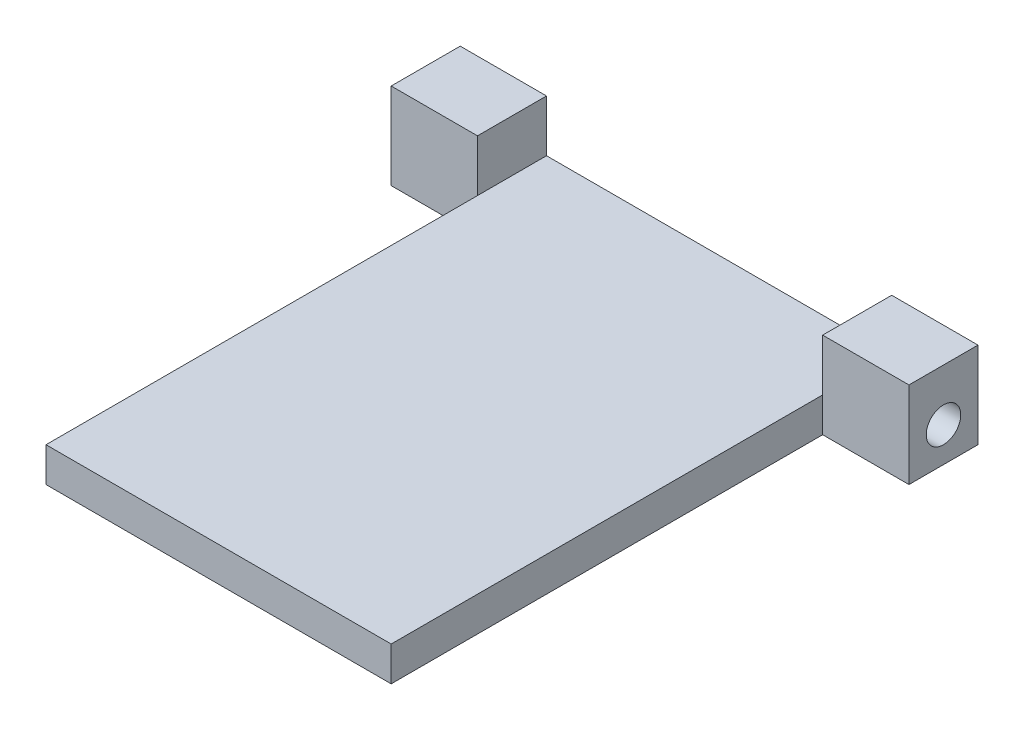
ISO-10303-21;
HEADER;
FILE_DESCRIPTION(('STEP AP214'),'2;1');
FILE_NAME('part.step','',(''),(''),'','','');
FILE_SCHEMA(('AUTOMOTIVE_DESIGN { 1 0 10303 214 1 1 1 1 }'));
ENDSEC;
DATA;
#1=APPLICATION_CONTEXT('core data for automotive mechanical design processes');
#2=APPLICATION_PROTOCOL_DEFINITION('international standard','automotive_design',2000,#1);
#3=PRODUCT_CONTEXT('',#1,'mechanical');
#4=PRODUCT('Part','Part','',(#3));
#5=PRODUCT_RELATED_PRODUCT_CATEGORY('part','',(#4));
#6=PRODUCT_DEFINITION_FORMATION('','',#4);
#7=PRODUCT_DEFINITION_CONTEXT('part definition',#1,'design');
#8=PRODUCT_DEFINITION('design','',#6,#7);
#9=PRODUCT_DEFINITION_SHAPE('','',#8);
#10=(LENGTH_UNIT() NAMED_UNIT(*) SI_UNIT(.MILLI.,.METRE.));
#11=(NAMED_UNIT(*) PLANE_ANGLE_UNIT() SI_UNIT($,.RADIAN.));
#12=(NAMED_UNIT(*) SI_UNIT($,.STERADIAN.) SOLID_ANGLE_UNIT());
#13=UNCERTAINTY_MEASURE_WITH_UNIT(LENGTH_MEASURE(1.E-05),#10,'distance_accuracy_value','');
#14=(GEOMETRIC_REPRESENTATION_CONTEXT(3) GLOBAL_UNCERTAINTY_ASSIGNED_CONTEXT((#13)) GLOBAL_UNIT_ASSIGNED_CONTEXT((#10,
#11,#12)) REPRESENTATION_CONTEXT('',''));
#15=CARTESIAN_POINT('',(0.,0.,0.));
#16=DIRECTION('',(0.,0.,1.));
#17=DIRECTION('',(1.,0.,0.));
#18=AXIS2_PLACEMENT_3D('',#15,#16,#17);
#19=CARTESIAN_POINT('',(-50.,-40.,85.));
#20=DIRECTION('',(-1.,0.,0.));
#21=DIRECTION('',(0.,-1.,0.));
#22=AXIS2_PLACEMENT_3D('',#19,#20,#21);
#23=PLANE('',#22);
#24=DIRECTION('',(0.,1.,0.));
#25=VECTOR('',#24,1.);
#26=CARTESIAN_POINT('',(-50.,-50.,60.));
#27=LINE('',#26,#25);
#28=CARTESIAN_POINT('',(-50.,-50.,60.));
#29=VERTEX_POINT('',#28);
#30=CARTESIAN_POINT('',(-50.,-40.,60.));
#31=VERTEX_POINT('',#30);
#32=EDGE_CURVE('E62',#29,#31,#27,.T.);
#33=ORIENTED_EDGE('',*,*,#32,.T.);
#34=DIRECTION('',(0.,0.,-1.));
#35=VECTOR('',#34,1.);
#36=CARTESIAN_POINT('',(-50.,-40.,85.));
#37=LINE('',#36,#35);
#38=CARTESIAN_POINT('',(-50.,-40.,-65.));
#39=VERTEX_POINT('',#38);
#40=EDGE_CURVE('E152',#31,#39,#37,.T.);
#41=ORIENTED_EDGE('',*,*,#40,.T.);
#42=DIRECTION('',(0.,1.,0.));
#43=VECTOR('',#42,1.);
#44=CARTESIAN_POINT('',(-50.,-50.,-65.));
#45=LINE('',#44,#43);
#46=CARTESIAN_POINT('',(-50.,-50.,-65.));
#47=VERTEX_POINT('',#46);
#48=EDGE_CURVE('E185',#47,#39,#45,.T.);
#49=ORIENTED_EDGE('',*,*,#48,.F.);
#50=DIRECTION('',(0.,0.,-1.));
#51=VECTOR('',#50,1.);
#52=CARTESIAN_POINT('',(-50.,-50.,85.));
#53=LINE('',#52,#51);
#54=EDGE_CURVE('E154',#29,#47,#53,.T.);
#55=ORIENTED_EDGE('',*,*,#54,.F.);
#56=EDGE_LOOP('',(#33,#41,#49,#55));
#57=FACE_BOUND('',#56,.T.);
#58=ADVANCED_FACE('F44',(#57),#23,.T.);
#59=CARTESIAN_POINT('',(50.,-40.,-85.));
#60=DIRECTION('',(1.,0.,0.));
#61=DIRECTION('',(0.,1.,0.));
#62=AXIS2_PLACEMENT_3D('',#59,#60,#61);
#63=PLANE('',#62);
#64=DIRECTION('',(0.,1.,0.));
#65=VECTOR('',#64,1.);
#66=CARTESIAN_POINT('',(50.,-50.,60.));
#67=LINE('',#66,#65);
#68=CARTESIAN_POINT('',(50.,-50.,60.));
#69=VERTEX_POINT('',#68);
#70=CARTESIAN_POINT('',(50.,-40.,60.));
#71=VERTEX_POINT('',#70);
#72=EDGE_CURVE('E129',#69,#71,#67,.T.);
#73=ORIENTED_EDGE('',*,*,#72,.F.);
#74=DIRECTION('',(0.,0.,1.));
#75=VECTOR('',#74,1.);
#76=CARTESIAN_POINT('',(50.,-50.,-85.));
#77=LINE('',#76,#75);
#78=CARTESIAN_POINT('',(50.,-50.,-65.));
#79=VERTEX_POINT('',#78);
#80=EDGE_CURVE('E47',#79,#69,#77,.T.);
#81=ORIENTED_EDGE('',*,*,#80,.F.);
#82=DIRECTION('',(0.,-1.,0.));
#83=VECTOR('',#82,1.);
#84=CARTESIAN_POINT('',(50.,-50.,-65.));
#85=LINE('',#84,#83);
#86=CARTESIAN_POINT('',(50.,-40.,-65.));
#87=VERTEX_POINT('',#86);
#88=EDGE_CURVE('E11',#87,#79,#85,.T.);
#89=ORIENTED_EDGE('',*,*,#88,.F.);
#90=DIRECTION('',(0.,0.,1.));
#91=VECTOR('',#90,1.);
#92=CARTESIAN_POINT('',(50.,-40.,-85.));
#93=LINE('',#92,#91);
#94=EDGE_CURVE('E138',#87,#71,#93,.T.);
#95=ORIENTED_EDGE('',*,*,#94,.T.);
#96=EDGE_LOOP('',(#73,#81,#89,#95));
#97=FACE_BOUND('',#96,.T.);
#98=ADVANCED_FACE('F137',(#97),#63,.T.);
#99=CARTESIAN_POINT('',(-50.,-40.,-85.));
#100=DIRECTION('',(0.,0.,-1.));
#101=DIRECTION('',(-1.,0.,0.));
#102=AXIS2_PLACEMENT_3D('',#99,#100,#101);
#103=PLANE('',#102);
#104=DIRECTION('',(1.,0.,0.));
#105=VECTOR('',#104,1.);
#106=CARTESIAN_POINT('',(-50.,-50.,-85.));
#107=LINE('',#106,#105);
#108=CARTESIAN_POINT('',(-75.,-50.,-85.));
#109=VERTEX_POINT('',#108);
#110=CARTESIAN_POINT('',(75.,-50.,-85.));
#111=VERTEX_POINT('',#110);
#112=EDGE_CURVE('E148',#109,#111,#107,.T.);
#113=ORIENTED_EDGE('',*,*,#112,.F.);
#114=DIRECTION('',(0.,-1.,0.));
#115=VECTOR('',#114,1.);
#116=CARTESIAN_POINT('',(-75.,-25.,-85.));
#117=LINE('',#116,#115);
#118=CARTESIAN_POINT('',(-75.,-25.,-85.));
#119=VERTEX_POINT('',#118);
#120=EDGE_CURVE('E184',#119,#109,#117,.T.);
#121=ORIENTED_EDGE('',*,*,#120,.F.);
#122=DIRECTION('',(1.,0.,0.));
#123=VECTOR('',#122,1.);
#124=CARTESIAN_POINT('',(-75.,-25.,-85.));
#125=LINE('',#124,#123);
#126=CARTESIAN_POINT('',(-50.,-25.,-85.));
#127=VERTEX_POINT('',#126);
#128=EDGE_CURVE('E176',#119,#127,#125,.T.);
#129=ORIENTED_EDGE('',*,*,#128,.T.);
#130=DIRECTION('',(0.,-1.,0.));
#131=VECTOR('',#130,1.);
#132=CARTESIAN_POINT('',(-50.,-25.,-85.));
#133=LINE('',#132,#131);
#134=CARTESIAN_POINT('',(-50.,-40.,-85.));
#135=VERTEX_POINT('',#134);
#136=EDGE_CURVE('E190',#127,#135,#133,.T.);
#137=ORIENTED_EDGE('',*,*,#136,.T.);
#138=DIRECTION('',(1.,0.,0.));
#139=VECTOR('',#138,1.);
#140=CARTESIAN_POINT('',(-50.,-40.,-85.));
#141=LINE('',#140,#139);
#142=CARTESIAN_POINT('',(50.,-40.,-85.));
#143=VERTEX_POINT('',#142);
#144=EDGE_CURVE('E164',#135,#143,#141,.T.);
#145=ORIENTED_EDGE('',*,*,#144,.T.);
#146=DIRECTION('',(0.,1.,0.));
#147=VECTOR('',#146,1.);
#148=CARTESIAN_POINT('',(50.,-25.,-85.));
#149=LINE('',#148,#147);
#150=CARTESIAN_POINT('',(50.,-25.,-85.));
#151=VERTEX_POINT('',#150);
#152=EDGE_CURVE('E222',#143,#151,#149,.T.);
#153=ORIENTED_EDGE('',*,*,#152,.T.);
#154=DIRECTION('',(-1.,0.,0.));
#155=VECTOR('',#154,1.);
#156=CARTESIAN_POINT('',(75.,-25.,-85.));
#157=LINE('',#156,#155);
#158=CARTESIAN_POINT('',(75.,-25.,-85.));
#159=VERTEX_POINT('',#158);
#160=EDGE_CURVE('E194',#159,#151,#157,.T.);
#161=ORIENTED_EDGE('',*,*,#160,.F.);
#162=DIRECTION('',(0.,1.,0.));
#163=VECTOR('',#162,1.);
#164=CARTESIAN_POINT('',(75.,-25.,-85.));
#165=LINE('',#164,#163);
#166=EDGE_CURVE('E231',#111,#159,#165,.T.);
#167=ORIENTED_EDGE('',*,*,#166,.F.);
#168=EDGE_LOOP('',(#113,#121,#129,#137,#145,#153,#161,#167));
#169=FACE_BOUND('',#168,.T.);
#170=ADVANCED_FACE('F278',(#169),#103,.T.);
#171=CARTESIAN_POINT('',(0.,-40.,0.));
#172=DIRECTION('',(0.,-1.,0.));
#173=DIRECTION('',(1.,0.,0.));
#174=AXIS2_PLACEMENT_3D('',#171,#172,#173);
#175=PLANE('',#174);
#176=ORIENTED_EDGE('',*,*,#40,.F.);
#177=DIRECTION('',(-1.,0.,0.));
#178=VECTOR('',#177,1.);
#179=CARTESIAN_POINT('',(-50.,-40.,60.));
#180=LINE('',#179,#178);
#181=EDGE_CURVE('E135',#71,#31,#180,.T.);
#182=ORIENTED_EDGE('',*,*,#181,.F.);
#183=ORIENTED_EDGE('',*,*,#94,.F.);
#184=EDGE_CURVE('E53',#143,#87,#93,.T.);
#185=ORIENTED_EDGE('',*,*,#184,.F.);
#186=ORIENTED_EDGE('',*,*,#144,.F.);
#187=EDGE_CURVE('E147',#39,#135,#37,.T.);
#188=ORIENTED_EDGE('',*,*,#187,.F.);
#189=EDGE_LOOP('',(#176,#182,#183,#185,#186,#188));
#190=FACE_BOUND('',#189,.T.);
#191=ADVANCED_FACE('F260',(#190),#175,.F.);
#192=CARTESIAN_POINT('',(0.,-50.,0.));
#193=DIRECTION('',(0.,-1.,0.));
#194=DIRECTION('',(1.,0.,0.));
#195=AXIS2_PLACEMENT_3D('',#192,#193,#194);
#196=PLANE('',#195);
#197=DIRECTION('',(-1.,0.,0.));
#198=VECTOR('',#197,1.);
#199=CARTESIAN_POINT('',(-50.,-50.,60.));
#200=LINE('',#199,#198);
#201=EDGE_CURVE('E126',#69,#29,#200,.T.);
#202=ORIENTED_EDGE('',*,*,#201,.T.);
#203=ORIENTED_EDGE('',*,*,#54,.T.);
#204=DIRECTION('',(1.,0.,0.));
#205=VECTOR('',#204,1.);
#206=CARTESIAN_POINT('',(-75.,-50.,-65.));
#207=LINE('',#206,#205);
#208=CARTESIAN_POINT('',(-75.,-50.,-65.));
#209=VERTEX_POINT('',#208);
#210=EDGE_CURVE('E158',#209,#47,#207,.T.);
#211=ORIENTED_EDGE('',*,*,#210,.F.);
#212=DIRECTION('',(0.,0.,1.));
#213=VECTOR('',#212,1.);
#214=CARTESIAN_POINT('',(-75.,-50.,-85.));
#215=LINE('',#214,#213);
#216=EDGE_CURVE('E200',#109,#209,#215,.T.);
#217=ORIENTED_EDGE('',*,*,#216,.F.);
#218=ORIENTED_EDGE('',*,*,#112,.T.);
#219=DIRECTION('',(0.,0.,-1.));
#220=VECTOR('',#219,1.);
#221=CARTESIAN_POINT('',(75.,-50.,-85.));
#222=LINE('',#221,#220);
#223=CARTESIAN_POINT('',(75.,-50.,-65.));
#224=VERTEX_POINT('',#223);
#225=EDGE_CURVE('E218',#224,#111,#222,.T.);
#226=ORIENTED_EDGE('',*,*,#225,.F.);
#227=DIRECTION('',(-1.,0.,0.));
#228=VECTOR('',#227,1.);
#229=CARTESIAN_POINT('',(75.,-50.,-65.));
#230=LINE('',#229,#228);
#231=EDGE_CURVE('E145',#224,#79,#230,.T.);
#232=ORIENTED_EDGE('',*,*,#231,.T.);
#233=ORIENTED_EDGE('',*,*,#80,.T.);
#234=EDGE_LOOP('',(#202,#203,#211,#217,#218,#226,#232,#233));
#235=FACE_BOUND('',#234,.T.);
#236=ADVANCED_FACE('F142',(#235),#196,.T.);
#237=CARTESIAN_POINT('',(-50.,0.,0.));
#238=DIRECTION('',(-1.,0.,0.));
#239=DIRECTION('',(0.,0.,1.));
#240=AXIS2_PLACEMENT_3D('',#237,#238,#239);
#241=PLANE('',#240);
#242=CARTESIAN_POINT('',(-50.,-25.,-65.));
#243=VERTEX_POINT('',#242);
#244=EDGE_CURVE('E189',#39,#243,#45,.T.);
#245=ORIENTED_EDGE('',*,*,#244,.F.);
#246=ORIENTED_EDGE('',*,*,#187,.T.);
#247=ORIENTED_EDGE('',*,*,#136,.F.);
#248=DIRECTION('',(0.,0.,-1.));
#249=VECTOR('',#248,1.);
#250=CARTESIAN_POINT('',(-50.,-25.,-65.));
#251=LINE('',#250,#249);
#252=EDGE_CURVE('E181',#243,#127,#251,.T.);
#253=ORIENTED_EDGE('',*,*,#252,.F.);
#254=EDGE_LOOP('',(#245,#246,#247,#253));
#255=FACE_BOUND('',#254,.T.);
#256=ADVANCED_FACE('F265',(#255),#241,.F.);
#257=CARTESIAN_POINT('',(-75.,-50.,-65.));
#258=DIRECTION('',(0.,0.,-1.));
#259=DIRECTION('',(-1.,0.,0.));
#260=AXIS2_PLACEMENT_3D('',#257,#258,#259);
#261=PLANE('',#260);
#262=ORIENTED_EDGE('',*,*,#48,.T.);
#263=ORIENTED_EDGE('',*,*,#244,.T.);
#264=DIRECTION('',(1.,0.,0.));
#265=VECTOR('',#264,1.);
#266=CARTESIAN_POINT('',(-75.,-25.,-65.));
#267=LINE('',#266,#265);
#268=CARTESIAN_POINT('',(-75.,-25.,-65.));
#269=VERTEX_POINT('',#268);
#270=EDGE_CURVE('E172',#269,#243,#267,.T.);
#271=ORIENTED_EDGE('',*,*,#270,.F.);
#272=DIRECTION('',(0.,1.,0.));
#273=VECTOR('',#272,1.);
#274=CARTESIAN_POINT('',(-75.,-50.,-65.));
#275=LINE('',#274,#273);
#276=EDGE_CURVE('E197',#209,#269,#275,.T.);
#277=ORIENTED_EDGE('',*,*,#276,.F.);
#278=ORIENTED_EDGE('',*,*,#210,.T.);
#279=EDGE_LOOP('',(#262,#263,#271,#277,#278));
#280=FACE_BOUND('',#279,.T.);
#281=ADVANCED_FACE('F269',(#280),#261,.F.);
#282=CARTESIAN_POINT('',(-75.,-25.,-65.));
#283=DIRECTION('',(0.,-1.,0.));
#284=DIRECTION('',(1.,0.,0.));
#285=AXIS2_PLACEMENT_3D('',#282,#283,#284);
#286=PLANE('',#285);
#287=ORIENTED_EDGE('',*,*,#252,.T.);
#288=ORIENTED_EDGE('',*,*,#128,.F.);
#289=DIRECTION('',(0.,0.,-1.));
#290=VECTOR('',#289,1.);
#291=CARTESIAN_POINT('',(-75.,-25.,-65.));
#292=LINE('',#291,#290);
#293=EDGE_CURVE('E180',#269,#119,#292,.T.);
#294=ORIENTED_EDGE('',*,*,#293,.F.);
#295=ORIENTED_EDGE('',*,*,#270,.T.);
#296=EDGE_LOOP('',(#287,#288,#294,#295));
#297=FACE_BOUND('',#296,.T.);
#298=ADVANCED_FACE('F302',(#297),#286,.F.);
#299=CARTESIAN_POINT('',(-75.,0.,0.));
#300=DIRECTION('',(-1.,0.,0.));
#301=DIRECTION('',(0.,0.,1.));
#302=AXIS2_PLACEMENT_3D('',#299,#300,#301);
#303=PLANE('',#302);
#304=CARTESIAN_POINT('',(-75.,-40.,-75.));
#305=DIRECTION('',(-1.,0.,0.));
#306=DIRECTION('',(0.,0.,1.));
#307=AXIS2_PLACEMENT_3D('',#304,#305,#306);
#308=CIRCLE('',#307,5.00000000000001);
#309=CARTESIAN_POINT('',(-75.,-40.,-70.));
#310=VERTEX_POINT('',#309);
#311=EDGE_CURVE('E237',#310,#310,#308,.T.);
#312=ORIENTED_EDGE('',*,*,#311,.F.);
#313=EDGE_LOOP('',(#312));
#314=FACE_BOUND('',#313,.T.);
#315=ORIENTED_EDGE('',*,*,#120,.T.);
#316=ORIENTED_EDGE('',*,*,#216,.T.);
#317=ORIENTED_EDGE('',*,*,#276,.T.);
#318=ORIENTED_EDGE('',*,*,#293,.T.);
#319=EDGE_LOOP('',(#315,#316,#317,#318));
#320=FACE_BOUND('',#319,.T.);
#321=ADVANCED_FACE('F274',(#314,#320),#303,.T.);
#322=CARTESIAN_POINT('',(75.,-25.,-65.));
#323=DIRECTION('',(0.,-1.,0.));
#324=DIRECTION('',(1.,0.,0.));
#325=AXIS2_PLACEMENT_3D('',#322,#323,#324);
#326=PLANE('',#325);
#327=DIRECTION('',(0.,0.,1.));
#328=VECTOR('',#327,1.);
#329=CARTESIAN_POINT('',(50.,-25.,-65.));
#330=LINE('',#329,#328);
#331=CARTESIAN_POINT('',(50.,-25.,-65.));
#332=VERTEX_POINT('',#331);
#333=EDGE_CURVE('E219',#151,#332,#330,.T.);
#334=ORIENTED_EDGE('',*,*,#333,.T.);
#335=DIRECTION('',(-1.,0.,0.));
#336=VECTOR('',#335,1.);
#337=CARTESIAN_POINT('',(75.,-25.,-65.));
#338=LINE('',#337,#336);
#339=CARTESIAN_POINT('',(75.,-25.,-65.));
#340=VERTEX_POINT('',#339);
#341=EDGE_CURVE('E209',#340,#332,#338,.T.);
#342=ORIENTED_EDGE('',*,*,#341,.F.);
#343=DIRECTION('',(0.,0.,1.));
#344=VECTOR('',#343,1.);
#345=CARTESIAN_POINT('',(75.,-25.,-65.));
#346=LINE('',#345,#344);
#347=EDGE_CURVE('E228',#159,#340,#346,.T.);
#348=ORIENTED_EDGE('',*,*,#347,.F.);
#349=ORIENTED_EDGE('',*,*,#160,.T.);
#350=EDGE_LOOP('',(#334,#342,#348,#349));
#351=FACE_BOUND('',#350,.T.);
#352=ADVANCED_FACE('F293',(#351),#326,.F.);
#353=CARTESIAN_POINT('',(75.,-50.,-65.));
#354=DIRECTION('',(0.,0.,-1.));
#355=DIRECTION('',(0.,1.,0.));
#356=AXIS2_PLACEMENT_3D('',#353,#354,#355);
#357=PLANE('',#356);
#358=EDGE_CURVE('E55',#332,#87,#85,.T.);
#359=ORIENTED_EDGE('',*,*,#358,.T.);
#360=ORIENTED_EDGE('',*,*,#88,.T.);
#361=ORIENTED_EDGE('',*,*,#231,.F.);
#362=DIRECTION('',(0.,-1.,0.));
#363=VECTOR('',#362,1.);
#364=CARTESIAN_POINT('',(75.,-50.,-65.));
#365=LINE('',#364,#363);
#366=EDGE_CURVE('E214',#340,#224,#365,.T.);
#367=ORIENTED_EDGE('',*,*,#366,.F.);
#368=ORIENTED_EDGE('',*,*,#341,.T.);
#369=EDGE_LOOP('',(#359,#360,#361,#367,#368));
#370=FACE_BOUND('',#369,.T.);
#371=ADVANCED_FACE('F286',(#370),#357,.F.);
#372=CARTESIAN_POINT('',(75.,0.,0.));
#373=DIRECTION('',(-1.,0.,0.));
#374=DIRECTION('',(0.,0.,1.));
#375=AXIS2_PLACEMENT_3D('',#372,#373,#374);
#376=PLANE('',#375);
#377=CARTESIAN_POINT('',(75.,-40.,-75.));
#378=DIRECTION('',(1.,0.,0.));
#379=DIRECTION('',(0.,0.,-1.));
#380=AXIS2_PLACEMENT_3D('',#377,#378,#379);
#381=CIRCLE('',#380,5.00000000000001);
#382=CARTESIAN_POINT('',(75.,-40.,-80.));
#383=VERTEX_POINT('',#382);
#384=EDGE_CURVE('E245',#383,#383,#381,.T.);
#385=ORIENTED_EDGE('',*,*,#384,.F.);
#386=EDGE_LOOP('',(#385));
#387=FACE_BOUND('',#386,.T.);
#388=ORIENTED_EDGE('',*,*,#225,.T.);
#389=ORIENTED_EDGE('',*,*,#166,.T.);
#390=ORIENTED_EDGE('',*,*,#347,.T.);
#391=ORIENTED_EDGE('',*,*,#366,.T.);
#392=EDGE_LOOP('',(#388,#389,#390,#391));
#393=FACE_BOUND('',#392,.T.);
#394=ADVANCED_FACE('F282',(#387,#393),#376,.F.);
#395=CARTESIAN_POINT('',(50.,0.,0.));
#396=DIRECTION('',(-1.,0.,0.));
#397=DIRECTION('',(0.,0.,1.));
#398=AXIS2_PLACEMENT_3D('',#395,#396,#397);
#399=PLANE('',#398);
#400=ORIENTED_EDGE('',*,*,#152,.F.);
#401=ORIENTED_EDGE('',*,*,#184,.T.);
#402=ORIENTED_EDGE('',*,*,#358,.F.);
#403=ORIENTED_EDGE('',*,*,#333,.F.);
#404=EDGE_LOOP('',(#400,#401,#402,#403));
#405=FACE_BOUND('',#404,.T.);
#406=ADVANCED_FACE('F291',(#405),#399,.T.);
#407=CARTESIAN_POINT('',(-55.,-40.,-75.));
#408=DIRECTION('',(-1.,0.,0.));
#409=DIRECTION('',(0.,0.,1.));
#410=AXIS2_PLACEMENT_3D('',#407,#408,#409);
#411=CYLINDRICAL_SURFACE('',#410,5.00000000000001);
#412=CARTESIAN_POINT('',(-55.,-40.,-75.));
#413=DIRECTION('',(-1.,0.,0.));
#414=DIRECTION('',(0.,0.,1.));
#415=AXIS2_PLACEMENT_3D('',#412,#413,#414);
#416=CIRCLE('',#415,5.00000000000001);
#417=CARTESIAN_POINT('',(-55.,-40.,-70.));
#418=VERTEX_POINT('',#417);
#419=EDGE_CURVE('E225',#418,#418,#416,.T.);
#420=ORIENTED_EDGE('',*,*,#419,.F.);
#421=EDGE_LOOP('',(#420));
#422=FACE_BOUND('',#421,.T.);
#423=ORIENTED_EDGE('',*,*,#311,.T.);
#424=EDGE_LOOP('',(#423));
#425=FACE_BOUND('',#424,.T.);
#426=ADVANCED_FACE('F390',(#422,#425),#411,.F.);
#427=CARTESIAN_POINT('',(-55.,-40.,-75.));
#428=DIRECTION('',(-1.,0.,0.));
#429=DIRECTION('',(0.,0.,1.));
#430=AXIS2_PLACEMENT_3D('',#427,#428,#429);
#431=PLANE('',#430);
#432=ORIENTED_EDGE('',*,*,#419,.T.);
#433=EDGE_LOOP('',(#432));
#434=FACE_BOUND('',#433,.T.);
#435=ADVANCED_FACE('F399',(#434),#431,.T.);
#436=CARTESIAN_POINT('',(55.,-40.,-75.));
#437=DIRECTION('',(1.,0.,0.));
#438=DIRECTION('',(0.,0.,-1.));
#439=AXIS2_PLACEMENT_3D('',#436,#437,#438);
#440=CYLINDRICAL_SURFACE('',#439,5.00000000000001);
#441=CARTESIAN_POINT('',(55.,-40.,-75.));
#442=DIRECTION('',(1.,0.,0.));
#443=DIRECTION('',(0.,0.,-1.));
#444=AXIS2_PLACEMENT_3D('',#441,#442,#443);
#445=CIRCLE('',#444,5.00000000000001);
#446=CARTESIAN_POINT('',(55.,-40.,-80.));
#447=VERTEX_POINT('',#446);
#448=EDGE_CURVE('E241',#447,#447,#445,.T.);
#449=ORIENTED_EDGE('',*,*,#448,.F.);
#450=EDGE_LOOP('',(#449));
#451=FACE_BOUND('',#450,.T.);
#452=ORIENTED_EDGE('',*,*,#384,.T.);
#453=EDGE_LOOP('',(#452));
#454=FACE_BOUND('',#453,.T.);
#455=ADVANCED_FACE('F408',(#451,#454),#440,.F.);
#456=CARTESIAN_POINT('',(55.,-40.,-75.));
#457=DIRECTION('',(1.,0.,0.));
#458=DIRECTION('',(0.,0.,-1.));
#459=AXIS2_PLACEMENT_3D('',#456,#457,#458);
#460=PLANE('',#459);
#461=ORIENTED_EDGE('',*,*,#448,.T.);
#462=EDGE_LOOP('',(#461));
#463=FACE_BOUND('',#462,.T.);
#464=ADVANCED_FACE('F417',(#463),#460,.T.);
#465=CARTESIAN_POINT('',(-50.,-50.,60.));
#466=DIRECTION('',(0.,0.,-1.));
#467=DIRECTION('',(-1.,0.,0.));
#468=AXIS2_PLACEMENT_3D('',#465,#466,#467);
#469=PLANE('',#468);
#470=ORIENTED_EDGE('',*,*,#181,.T.);
#471=ORIENTED_EDGE('',*,*,#32,.F.);
#472=ORIENTED_EDGE('',*,*,#201,.F.);
#473=ORIENTED_EDGE('',*,*,#72,.T.);
#474=EDGE_LOOP('',(#470,#471,#472,#473));
#475=FACE_BOUND('',#474,.T.);
#476=ADVANCED_FACE('F128',(#475),#469,.F.);
#477=CLOSED_SHELL('',(#58,#98,#170,#191,#236,#256,#281,#298,#321,#352,#371,#394,#406,#426,#435,
#455,#464,#476));
#478=MANIFOLD_SOLID_BREP('B2',#477);
#479=ADVANCED_BREP_SHAPE_REPRESENTATION('',(#18,#478),#14);
#480=SHAPE_DEFINITION_REPRESENTATION(#9,#479);
ENDSEC;
END-ISO-10303-21;
